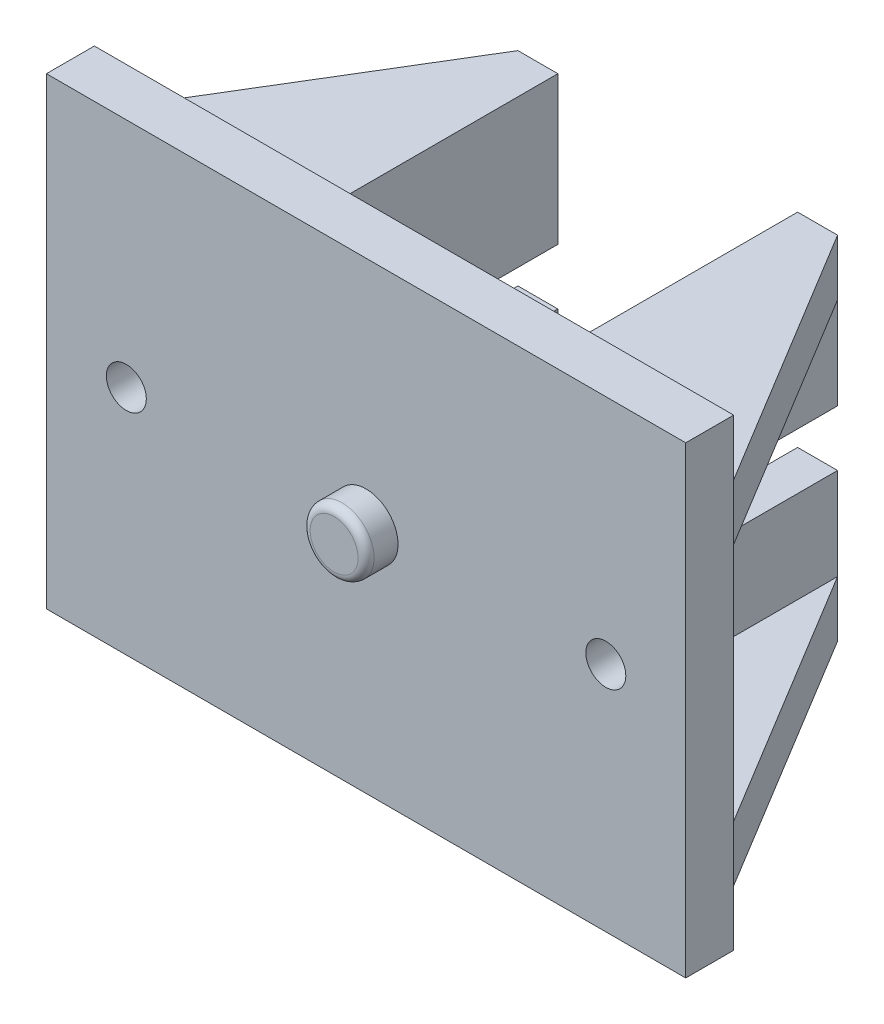
ISO-10303-21;
HEADER;
FILE_DESCRIPTION(('STEP AP214'),'2;1');
FILE_NAME('part.step','',(''),(''),'','','');
FILE_SCHEMA(('AUTOMOTIVE_DESIGN { 1 0 10303 214 1 1 1 1 }'));
ENDSEC;
DATA;
#1=APPLICATION_CONTEXT('core data for automotive mechanical design processes');
#2=APPLICATION_PROTOCOL_DEFINITION('international standard','automotive_design',2000,#1);
#3=PRODUCT_CONTEXT('',#1,'mechanical');
#4=PRODUCT('Part','Part','',(#3));
#5=PRODUCT_RELATED_PRODUCT_CATEGORY('part','',(#4));
#6=PRODUCT_DEFINITION_FORMATION('','',#4);
#7=PRODUCT_DEFINITION_CONTEXT('part definition',#1,'design');
#8=PRODUCT_DEFINITION('design','',#6,#7);
#9=PRODUCT_DEFINITION_SHAPE('','',#8);
#10=(LENGTH_UNIT() NAMED_UNIT(*) SI_UNIT(.MILLI.,.METRE.));
#11=(NAMED_UNIT(*) PLANE_ANGLE_UNIT() SI_UNIT($,.RADIAN.));
#12=(NAMED_UNIT(*) SI_UNIT($,.STERADIAN.) SOLID_ANGLE_UNIT());
#13=UNCERTAINTY_MEASURE_WITH_UNIT(LENGTH_MEASURE(1.E-05),#10,'distance_accuracy_value','');
#14=(GEOMETRIC_REPRESENTATION_CONTEXT(3) GLOBAL_UNCERTAINTY_ASSIGNED_CONTEXT((#13)) GLOBAL_UNIT_ASSIGNED_CONTEXT((#10,
#11,#12)) REPRESENTATION_CONTEXT('',''));
#15=CARTESIAN_POINT('',(0.,0.,0.));
#16=DIRECTION('',(0.,0.,1.));
#17=DIRECTION('',(1.,0.,0.));
#18=AXIS2_PLACEMENT_3D('',#15,#16,#17);
#19=CARTESIAN_POINT('',(0.,0.,0.));
#20=DIRECTION('',(0.,0.,-1.));
#21=DIRECTION('',(-1.,0.,0.));
#22=AXIS2_PLACEMENT_3D('',#19,#20,#21);
#23=PLANE('',#22);
#24=DIRECTION('',(1.,0.,0.));
#25=VECTOR('',#24,1.);
#26=CARTESIAN_POINT('',(20.,22.,0.));
#27=LINE('',#26,#25);
#28=CARTESIAN_POINT('',(15.,22.,0.));
#29=VERTEX_POINT('',#28);
#30=CARTESIAN_POINT('',(40.,22.,0.));
#31=VERTEX_POINT('',#30);
#32=EDGE_CURVE('E265',#29,#31,#27,.T.);
#33=ORIENTED_EDGE('',*,*,#32,.F.);
#34=DIRECTION('',(0.,1.,0.));
#35=VECTOR('',#34,1.);
#36=CARTESIAN_POINT('',(15.,22.,0.));
#37=LINE('',#36,#35);
#38=CARTESIAN_POINT('',(15.,-22.,0.));
#39=VERTEX_POINT('',#38);
#40=EDGE_CURVE('E268',#39,#29,#37,.T.);
#41=ORIENTED_EDGE('',*,*,#40,.F.);
#42=DIRECTION('',(-1.,0.,0.));
#43=VECTOR('',#42,1.);
#44=CARTESIAN_POINT('',(20.,-22.,0.));
#45=LINE('',#44,#43);
#46=CARTESIAN_POINT('',(40.,-22.,0.));
#47=VERTEX_POINT('',#46);
#48=EDGE_CURVE('E285',#47,#39,#45,.T.);
#49=ORIENTED_EDGE('',*,*,#48,.F.);
#50=DIRECTION('',(0.,1.,0.));
#51=VECTOR('',#50,1.);
#52=CARTESIAN_POINT('',(40.,-29.,0.));
#53=LINE('',#52,#51);
#54=CARTESIAN_POINT('',(40.,-29.,0.));
#55=VERTEX_POINT('',#54);
#56=EDGE_CURVE('E317',#55,#47,#53,.T.);
#57=ORIENTED_EDGE('',*,*,#56,.F.);
#58=DIRECTION('',(1.,0.,0.));
#59=VECTOR('',#58,1.);
#60=CARTESIAN_POINT('',(-40.,-29.,0.));
#61=LINE('',#60,#59);
#62=CARTESIAN_POINT('',(-40.,-29.,0.));
#63=VERTEX_POINT('',#62);
#64=EDGE_CURVE('E310',#63,#55,#61,.T.);
#65=ORIENTED_EDGE('',*,*,#64,.F.);
#66=DIRECTION('',(0.,-1.,0.));
#67=VECTOR('',#66,1.);
#68=CARTESIAN_POINT('',(-40.,-29.,0.));
#69=LINE('',#68,#67);
#70=CARTESIAN_POINT('',(-40.,-22.,0.));
#71=VERTEX_POINT('',#70);
#72=EDGE_CURVE('E324',#71,#63,#69,.T.);
#73=ORIENTED_EDGE('',*,*,#72,.F.);
#74=DIRECTION('',(-1.,0.,0.));
#75=VECTOR('',#74,1.);
#76=CARTESIAN_POINT('',(-15.,-22.,0.));
#77=LINE('',#76,#75);
#78=CARTESIAN_POINT('',(-15.,-22.,0.));
#79=VERTEX_POINT('',#78);
#80=EDGE_CURVE('E812',#79,#71,#77,.T.);
#81=ORIENTED_EDGE('',*,*,#80,.F.);
#82=DIRECTION('',(0.,-1.,0.));
#83=VECTOR('',#82,1.);
#84=CARTESIAN_POINT('',(-15.,22.,0.));
#85=LINE('',#84,#83);
#86=CARTESIAN_POINT('',(-15.,22.,0.));
#87=VERTEX_POINT('',#86);
#88=EDGE_CURVE('E798',#87,#79,#85,.T.);
#89=ORIENTED_EDGE('',*,*,#88,.F.);
#90=DIRECTION('',(1.,0.,0.));
#91=VECTOR('',#90,1.);
#92=CARTESIAN_POINT('',(-15.,22.,0.));
#93=LINE('',#92,#91);
#94=CARTESIAN_POINT('',(-40.,22.,0.));
#95=VERTEX_POINT('',#94);
#96=EDGE_CURVE('E816',#95,#87,#93,.T.);
#97=ORIENTED_EDGE('',*,*,#96,.F.);
#98=CARTESIAN_POINT('',(-40.,29.,0.));
#99=VERTEX_POINT('',#98);
#100=EDGE_CURVE('E325',#99,#95,#69,.T.);
#101=ORIENTED_EDGE('',*,*,#100,.F.);
#102=DIRECTION('',(-1.,0.,0.));
#103=VECTOR('',#102,1.);
#104=CARTESIAN_POINT('',(-40.,29.,0.));
#105=LINE('',#104,#103);
#106=CARTESIAN_POINT('',(40.,29.,0.));
#107=VERTEX_POINT('',#106);
#108=EDGE_CURVE('E320',#107,#99,#105,.T.);
#109=ORIENTED_EDGE('',*,*,#108,.F.);
#110=EDGE_CURVE('E304',#31,#107,#53,.T.);
#111=ORIENTED_EDGE('',*,*,#110,.F.);
#112=EDGE_LOOP('',(#33,#41,#49,#57,#65,#73,#81,#89,#97,#101,#109,#111));
#113=FACE_BOUND('',#112,.T.);
#114=ADVANCED_FACE('F33',(#113),#23,.T.);
#115=CARTESIAN_POINT('',(20.,22.,-33.));
#116=DIRECTION('',(-1.,0.,0.));
#117=DIRECTION('',(0.,0.,1.));
#118=AXIS2_PLACEMENT_3D('',#115,#116,#117);
#119=PLANE('',#118);
#120=DIRECTION('',(0.,-1.,0.));
#121=VECTOR('',#120,1.);
#122=CARTESIAN_POINT('',(20.,22.,0.));
#123=LINE('',#122,#121);
#124=CARTESIAN_POINT('',(20.,15.,0.));
#125=VERTEX_POINT('',#124);
#126=CARTESIAN_POINT('',(20.,-15.,0.));
#127=VERTEX_POINT('',#126);
#128=EDGE_CURVE('E258',#125,#127,#123,.T.);
#129=ORIENTED_EDGE('',*,*,#128,.T.);
#130=DIRECTION('',(0.,0.,-1.));
#131=VECTOR('',#130,1.);
#132=CARTESIAN_POINT('',(20.,-15.,-33.));
#133=LINE('',#132,#131);
#134=CARTESIAN_POINT('',(20.,-15.,-33.));
#135=VERTEX_POINT('',#134);
#136=EDGE_CURVE('E242',#127,#135,#133,.T.);
#137=ORIENTED_EDGE('',*,*,#136,.T.);
#138=DIRECTION('',(0.,-1.,0.));
#139=VECTOR('',#138,1.);
#140=CARTESIAN_POINT('',(20.,22.,-33.));
#141=LINE('',#140,#139);
#142=CARTESIAN_POINT('',(20.,-3.5,-33.));
#143=VERTEX_POINT('',#142);
#144=EDGE_CURVE('E255',#143,#135,#141,.T.);
#145=ORIENTED_EDGE('',*,*,#144,.F.);
#146=DIRECTION('',(0.,0.,1.));
#147=VECTOR('',#146,1.);
#148=CARTESIAN_POINT('',(20.,-3.5,-33.));
#149=LINE('',#148,#147);
#150=CARTESIAN_POINT('',(20.,-3.5,-11.));
#151=VERTEX_POINT('',#150);
#152=EDGE_CURVE('E774',#143,#151,#149,.T.);
#153=ORIENTED_EDGE('',*,*,#152,.T.);
#154=CARTESIAN_POINT('',(20.,-0.500000000000004,-11.));
#155=DIRECTION('',(-1.,0.,0.));
#156=DIRECTION('',(0.,0.,1.));
#157=AXIS2_PLACEMENT_3D('',#154,#155,#156);
#158=CIRCLE('',#157,3.);
#159=CARTESIAN_POINT('',(20.,-0.500000000000004,-8.));
#160=VERTEX_POINT('',#159);
#161=EDGE_CURVE('E795',#151,#160,#158,.T.);
#162=ORIENTED_EDGE('',*,*,#161,.T.);
#163=DIRECTION('',(0.,1.,0.));
#164=VECTOR('',#163,1.);
#165=CARTESIAN_POINT('',(20.,22.,-8.));
#166=LINE('',#165,#164);
#167=CARTESIAN_POINT('',(20.,0.500000000000004,-8.));
#168=VERTEX_POINT('',#167);
#169=EDGE_CURVE('E788',#160,#168,#166,.T.);
#170=ORIENTED_EDGE('',*,*,#169,.T.);
#171=CARTESIAN_POINT('',(20.,0.500000000000004,-11.));
#172=DIRECTION('',(-1.,0.,0.));
#173=DIRECTION('',(0.,0.,1.));
#174=AXIS2_PLACEMENT_3D('',#171,#172,#173);
#175=CIRCLE('',#174,3.);
#176=CARTESIAN_POINT('',(20.,3.5,-11.));
#177=VERTEX_POINT('',#176);
#178=EDGE_CURVE('E780',#168,#177,#175,.T.);
#179=ORIENTED_EDGE('',*,*,#178,.T.);
#180=DIRECTION('',(0.,0.,-1.));
#181=VECTOR('',#180,1.);
#182=CARTESIAN_POINT('',(20.,3.5,-33.));
#183=LINE('',#182,#181);
#184=CARTESIAN_POINT('',(20.,3.5,-33.));
#185=VERTEX_POINT('',#184);
#186=EDGE_CURVE('E765',#177,#185,#183,.T.);
#187=ORIENTED_EDGE('',*,*,#186,.T.);
#188=CARTESIAN_POINT('',(20.,15.,-33.));
#189=VERTEX_POINT('',#188);
#190=EDGE_CURVE('E264',#189,#185,#141,.T.);
#191=ORIENTED_EDGE('',*,*,#190,.F.);
#192=DIRECTION('',(0.,0.,-1.));
#193=VECTOR('',#192,1.);
#194=CARTESIAN_POINT('',(20.,15.,-33.));
#195=LINE('',#194,#193);
#196=EDGE_CURVE('E899',#125,#189,#195,.T.);
#197=ORIENTED_EDGE('',*,*,#196,.F.);
#198=EDGE_LOOP('',(#129,#137,#145,#153,#162,#170,#179,#187,#191,#197));
#199=FACE_BOUND('',#198,.T.);
#200=ADVANCED_FACE('F253',(#199),#119,.F.);
#201=DIRECTION('',(1.,0.,0.));
#202=VECTOR('',#201,1.);
#203=CARTESIAN_POINT('',(0.,-15.,0.));
#204=LINE('',#203,#202);
#205=CARTESIAN_POINT('',(-40.,-15.,0.));
#206=VERTEX_POINT('',#205);
#207=CARTESIAN_POINT('',(-20.,-15.,0.));
#208=VERTEX_POINT('',#207);
#209=EDGE_CURVE('E849',#206,#208,#204,.T.);
#210=ORIENTED_EDGE('',*,*,#209,.F.);
#211=CARTESIAN_POINT('',(-40.,15.,0.));
#212=VERTEX_POINT('',#211);
#213=EDGE_CURVE('E328',#212,#206,#69,.T.);
#214=ORIENTED_EDGE('',*,*,#213,.F.);
#215=DIRECTION('',(1.,0.,0.));
#216=VECTOR('',#215,1.);
#217=CARTESIAN_POINT('',(0.,15.,0.));
#218=LINE('',#217,#216);
#219=CARTESIAN_POINT('',(-20.,15.,0.));
#220=VERTEX_POINT('',#219);
#221=EDGE_CURVE('E862',#212,#220,#218,.T.);
#222=ORIENTED_EDGE('',*,*,#221,.T.);
#223=DIRECTION('',(0.,1.,0.));
#224=VECTOR('',#223,1.);
#225=CARTESIAN_POINT('',(-20.,22.,0.));
#226=LINE('',#225,#224);
#227=EDGE_CURVE('E814',#208,#220,#226,.T.);
#228=ORIENTED_EDGE('',*,*,#227,.F.);
#229=EDGE_LOOP('',(#210,#214,#222,#228));
#230=FACE_BOUND('',#229,.T.);
#231=CARTESIAN_POINT('',(-30.,0.,0.));
#232=DIRECTION('',(0.,0.,1.));
#233=DIRECTION('',(1.,0.,0.));
#234=AXIS2_PLACEMENT_3D('',#231,#232,#233);
#235=CIRCLE('',#234,2.5);
#236=CARTESIAN_POINT('',(-27.5,0.,0.));
#237=VERTEX_POINT('',#236);
#238=EDGE_CURVE('E298',#237,#237,#235,.T.);
#239=ORIENTED_EDGE('',*,*,#238,.T.);
#240=EDGE_LOOP('',(#239));
#241=FACE_BOUND('',#240,.T.);
#242=ADVANCED_FACE('F373',(#230,#241),#23,.T.);
#243=CARTESIAN_POINT('',(-20.,22.,-33.));
#244=DIRECTION('',(1.,0.,0.));
#245=DIRECTION('',(0.,1.,0.));
#246=AXIS2_PLACEMENT_3D('',#243,#244,#245);
#247=PLANE('',#246);
#248=DIRECTION('',(0.,1.,0.));
#249=VECTOR('',#248,1.);
#250=CARTESIAN_POINT('',(-20.,22.,-33.));
#251=LINE('',#250,#249);
#252=CARTESIAN_POINT('',(-20.,-15.,-33.));
#253=VERTEX_POINT('',#252);
#254=CARTESIAN_POINT('',(-20.,-3.49999999999999,-33.));
#255=VERTEX_POINT('',#254);
#256=EDGE_CURVE('E56',#253,#255,#251,.T.);
#257=ORIENTED_EDGE('',*,*,#256,.F.);
#258=DIRECTION('',(0.,0.,1.));
#259=VECTOR('',#258,1.);
#260=CARTESIAN_POINT('',(-20.,-15.,-33.));
#261=LINE('',#260,#259);
#262=EDGE_CURVE('E844',#253,#208,#261,.T.);
#263=ORIENTED_EDGE('',*,*,#262,.T.);
#264=ORIENTED_EDGE('',*,*,#227,.T.);
#265=DIRECTION('',(0.,0.,1.));
#266=VECTOR('',#265,1.);
#267=CARTESIAN_POINT('',(-20.,15.,-33.));
#268=LINE('',#267,#266);
#269=CARTESIAN_POINT('',(-20.,15.,-33.));
#270=VERTEX_POINT('',#269);
#271=EDGE_CURVE('E857',#270,#220,#268,.T.);
#272=ORIENTED_EDGE('',*,*,#271,.F.);
#273=CARTESIAN_POINT('',(-20.,3.5,-33.));
#274=VERTEX_POINT('',#273);
#275=EDGE_CURVE('E808',#274,#270,#251,.T.);
#276=ORIENTED_EDGE('',*,*,#275,.F.);
#277=DIRECTION('',(0.,0.,1.));
#278=VECTOR('',#277,1.);
#279=CARTESIAN_POINT('',(-20.,3.5,-33.));
#280=LINE('',#279,#278);
#281=CARTESIAN_POINT('',(-20.,3.50000000000001,-11.));
#282=VERTEX_POINT('',#281);
#283=EDGE_CURVE('E757',#274,#282,#280,.T.);
#284=ORIENTED_EDGE('',*,*,#283,.T.);
#285=CARTESIAN_POINT('',(-20.,0.500000000000009,-11.));
#286=DIRECTION('',(1.,0.,0.));
#287=DIRECTION('',(0.,1.,0.));
#288=AXIS2_PLACEMENT_3D('',#285,#286,#287);
#289=CIRCLE('',#288,3.);
#290=CARTESIAN_POINT('',(-20.,0.500000000000009,-8.));
#291=VERTEX_POINT('',#290);
#292=EDGE_CURVE('E347',#282,#291,#289,.T.);
#293=ORIENTED_EDGE('',*,*,#292,.T.);
#294=DIRECTION('',(0.,-1.,0.));
#295=VECTOR('',#294,1.);
#296=CARTESIAN_POINT('',(-20.,22.,-8.));
#297=LINE('',#296,#295);
#298=CARTESIAN_POINT('',(-20.,-0.499999999999999,-8.));
#299=VERTEX_POINT('',#298);
#300=EDGE_CURVE('E350',#291,#299,#297,.T.);
#301=ORIENTED_EDGE('',*,*,#300,.T.);
#302=CARTESIAN_POINT('',(-20.,-0.499999999999999,-11.));
#303=DIRECTION('',(1.,0.,0.));
#304=DIRECTION('',(0.,1.,0.));
#305=AXIS2_PLACEMENT_3D('',#302,#303,#304);
#306=CIRCLE('',#305,3.);
#307=CARTESIAN_POINT('',(-20.,-3.5,-11.));
#308=VERTEX_POINT('',#307);
#309=EDGE_CURVE('E353',#299,#308,#306,.T.);
#310=ORIENTED_EDGE('',*,*,#309,.T.);
#311=DIRECTION('',(0.,0.,-1.));
#312=VECTOR('',#311,1.);
#313=CARTESIAN_POINT('',(-20.,-3.5,-33.));
#314=LINE('',#313,#312);
#315=EDGE_CURVE('E731',#308,#255,#314,.T.);
#316=ORIENTED_EDGE('',*,*,#315,.T.);
#317=EDGE_LOOP('',(#257,#263,#264,#272,#276,#284,#293,#301,#310,#316));
#318=FACE_BOUND('',#317,.T.);
#319=ADVANCED_FACE('F383',(#318),#247,.F.);
#320=CARTESIAN_POINT('',(0.,0.,-33.));
#321=DIRECTION('',(0.,0.,-1.));
#322=DIRECTION('',(-1.,0.,0.));
#323=AXIS2_PLACEMENT_3D('',#320,#321,#322);
#324=PLANE('',#323);
#325=ORIENTED_EDGE('',*,*,#144,.T.);
#326=DIRECTION('',(0.,1.,0.));
#327=VECTOR('',#326,1.);
#328=CARTESIAN_POINT('',(20.,0.,-33.));
#329=LINE('',#328,#327);
#330=CARTESIAN_POINT('',(20.,-22.,-33.));
#331=VERTEX_POINT('',#330);
#332=EDGE_CURVE('E231',#135,#331,#329,.F.);
#333=ORIENTED_EDGE('',*,*,#332,.T.);
#334=DIRECTION('',(-1.,0.,0.));
#335=VECTOR('',#334,1.);
#336=CARTESIAN_POINT('',(20.,-22.,-33.));
#337=LINE('',#336,#335);
#338=CARTESIAN_POINT('',(15.,-22.,-33.));
#339=VERTEX_POINT('',#338);
#340=EDGE_CURVE('E273',#331,#339,#337,.T.);
#341=ORIENTED_EDGE('',*,*,#340,.T.);
#342=DIRECTION('',(0.,1.,0.));
#343=VECTOR('',#342,1.);
#344=CARTESIAN_POINT('',(15.,22.,-33.));
#345=LINE('',#344,#343);
#346=CARTESIAN_POINT('',(15.,-3.5,-33.));
#347=VERTEX_POINT('',#346);
#348=EDGE_CURVE('E278',#339,#347,#345,.T.);
#349=ORIENTED_EDGE('',*,*,#348,.T.);
#350=DIRECTION('',(1.,0.,0.));
#351=VECTOR('',#350,1.);
#352=CARTESIAN_POINT('',(-40.,-3.49999999999999,-33.));
#353=LINE('',#352,#351);
#354=EDGE_CURVE('E263',#347,#143,#353,.T.);
#355=ORIENTED_EDGE('',*,*,#354,.T.);
#356=EDGE_LOOP('',(#325,#333,#341,#349,#355));
#357=FACE_BOUND('',#356,.T.);
#358=ADVANCED_FACE('F261',(#357),#324,.T.);
#359=CARTESIAN_POINT('',(0.,0.,-33.));
#360=DIRECTION('',(0.,0.,-1.));
#361=DIRECTION('',(-1.,0.,0.));
#362=AXIS2_PLACEMENT_3D('',#359,#360,#361);
#363=PLANE('',#362);
#364=DIRECTION('',(0.,-1.,0.));
#365=VECTOR('',#364,1.);
#366=CARTESIAN_POINT('',(-15.,22.,-33.));
#367=LINE('',#366,#365);
#368=CARTESIAN_POINT('',(-15.,-3.5,-33.));
#369=VERTEX_POINT('',#368);
#370=CARTESIAN_POINT('',(-15.,-22.,-33.));
#371=VERTEX_POINT('',#370);
#372=EDGE_CURVE('E802',#369,#371,#367,.T.);
#373=ORIENTED_EDGE('',*,*,#372,.T.);
#374=DIRECTION('',(-1.,0.,0.));
#375=VECTOR('',#374,1.);
#376=CARTESIAN_POINT('',(-15.,-22.,-33.));
#377=LINE('',#376,#375);
#378=CARTESIAN_POINT('',(-20.,-22.,-33.));
#379=VERTEX_POINT('',#378);
#380=EDGE_CURVE('E801',#371,#379,#377,.T.);
#381=ORIENTED_EDGE('',*,*,#380,.T.);
#382=EDGE_CURVE('E805',#379,#253,#251,.T.);
#383=ORIENTED_EDGE('',*,*,#382,.T.);
#384=ORIENTED_EDGE('',*,*,#256,.T.);
#385=DIRECTION('',(-1.,0.,0.));
#386=VECTOR('',#385,1.);
#387=CARTESIAN_POINT('',(0.,-3.5,-33.));
#388=LINE('',#387,#386);
#389=EDGE_CURVE('E344',#369,#255,#388,.T.);
#390=ORIENTED_EDGE('',*,*,#389,.F.);
#391=EDGE_LOOP('',(#373,#381,#383,#384,#390));
#392=FACE_BOUND('',#391,.T.);
#393=ADVANCED_FACE('F387',(#392),#363,.T.);
#394=DIRECTION('',(1.,0.,0.));
#395=VECTOR('',#394,1.);
#396=CARTESIAN_POINT('',(0.,-15.,0.));
#397=LINE('',#396,#395);
#398=CARTESIAN_POINT('',(40.,-15.,0.));
#399=VERTEX_POINT('',#398);
#400=EDGE_CURVE('E248',#127,#399,#397,.T.);
#401=ORIENTED_EDGE('',*,*,#400,.F.);
#402=ORIENTED_EDGE('',*,*,#128,.F.);
#403=DIRECTION('',(1.,0.,0.));
#404=VECTOR('',#403,1.);
#405=CARTESIAN_POINT('',(0.,15.,0.));
#406=LINE('',#405,#404);
#407=CARTESIAN_POINT('',(40.,15.,0.));
#408=VERTEX_POINT('',#407);
#409=EDGE_CURVE('E846',#125,#408,#406,.T.);
#410=ORIENTED_EDGE('',*,*,#409,.T.);
#411=EDGE_CURVE('E322',#399,#408,#53,.T.);
#412=ORIENTED_EDGE('',*,*,#411,.F.);
#413=EDGE_LOOP('',(#401,#402,#410,#412));
#414=FACE_BOUND('',#413,.T.);
#415=CARTESIAN_POINT('',(30.,0.,0.));
#416=DIRECTION('',(0.,0.,1.));
#417=DIRECTION('',(1.,0.,0.));
#418=AXIS2_PLACEMENT_3D('',#415,#416,#417);
#419=CIRCLE('',#418,2.49999999999999);
#420=CARTESIAN_POINT('',(32.5,0.,0.));
#421=VERTEX_POINT('',#420);
#422=EDGE_CURVE('E294',#421,#421,#419,.T.);
#423=ORIENTED_EDGE('',*,*,#422,.T.);
#424=EDGE_LOOP('',(#423));
#425=FACE_BOUND('',#424,.T.);
#426=ADVANCED_FACE('F374',(#414,#425),#23,.T.);
#427=CARTESIAN_POINT('',(0.,0.,6.));
#428=DIRECTION('',(0.,0.,-1.));
#429=DIRECTION('',(-1.,0.,0.));
#430=AXIS2_PLACEMENT_3D('',#427,#428,#429);
#431=PLANE('',#430);
#432=DIRECTION('',(0.,-1.,0.));
#433=VECTOR('',#432,1.);
#434=CARTESIAN_POINT('',(-40.,-29.,6.));
#435=LINE('',#434,#433);
#436=CARTESIAN_POINT('',(-40.,29.,6.));
#437=VERTEX_POINT('',#436);
#438=CARTESIAN_POINT('',(-40.,-29.,6.));
#439=VERTEX_POINT('',#438);
#440=EDGE_CURVE('E312',#437,#439,#435,.T.);
#441=ORIENTED_EDGE('',*,*,#440,.T.);
#442=DIRECTION('',(1.,0.,0.));
#443=VECTOR('',#442,1.);
#444=CARTESIAN_POINT('',(-40.,-29.,6.));
#445=LINE('',#444,#443);
#446=CARTESIAN_POINT('',(40.,-29.,6.));
#447=VERTEX_POINT('',#446);
#448=EDGE_CURVE('E314',#439,#447,#445,.T.);
#449=ORIENTED_EDGE('',*,*,#448,.T.);
#450=DIRECTION('',(0.,1.,0.));
#451=VECTOR('',#450,1.);
#452=CARTESIAN_POINT('',(40.,-29.,6.));
#453=LINE('',#452,#451);
#454=CARTESIAN_POINT('',(40.,29.,6.));
#455=VERTEX_POINT('',#454);
#456=EDGE_CURVE('E307',#447,#455,#453,.T.);
#457=ORIENTED_EDGE('',*,*,#456,.T.);
#458=DIRECTION('',(-1.,0.,0.));
#459=VECTOR('',#458,1.);
#460=CARTESIAN_POINT('',(-40.,29.,6.));
#461=LINE('',#460,#459);
#462=EDGE_CURVE('E309',#455,#437,#461,.T.);
#463=ORIENTED_EDGE('',*,*,#462,.T.);
#464=EDGE_LOOP('',(#441,#449,#457,#463));
#465=FACE_BOUND('',#464,.T.);
#466=CARTESIAN_POINT('',(0.,0.,6.));
#467=DIRECTION('',(0.,0.,-1.));
#468=DIRECTION('',(-1.,0.,0.));
#469=AXIS2_PLACEMENT_3D('',#466,#467,#468);
#470=CIRCLE('',#469,4.);
#471=CARTESIAN_POINT('',(-4.,0.,6.));
#472=VERTEX_POINT('',#471);
#473=EDGE_CURVE('E356',#472,#472,#470,.F.);
#474=ORIENTED_EDGE('',*,*,#473,.F.);
#475=EDGE_LOOP('',(#474));
#476=FACE_BOUND('',#475,.T.);
#477=CARTESIAN_POINT('',(-30.,0.,6.));
#478=DIRECTION('',(0.,0.,1.));
#479=DIRECTION('',(1.,0.,0.));
#480=AXIS2_PLACEMENT_3D('',#477,#478,#479);
#481=CIRCLE('',#480,2.5);
#482=CARTESIAN_POINT('',(-27.5,0.,6.));
#483=VERTEX_POINT('',#482);
#484=EDGE_CURVE('E301',#483,#483,#481,.T.);
#485=ORIENTED_EDGE('',*,*,#484,.F.);
#486=EDGE_LOOP('',(#485));
#487=FACE_BOUND('',#486,.T.);
#488=CARTESIAN_POINT('',(30.,0.,6.));
#489=DIRECTION('',(0.,0.,1.));
#490=DIRECTION('',(1.,0.,0.));
#491=AXIS2_PLACEMENT_3D('',#488,#489,#490);
#492=CIRCLE('',#491,2.49999999999999);
#493=CARTESIAN_POINT('',(32.5,0.,6.));
#494=VERTEX_POINT('',#493);
#495=EDGE_CURVE('E295',#494,#494,#492,.T.);
#496=ORIENTED_EDGE('',*,*,#495,.F.);
#497=EDGE_LOOP('',(#496));
#498=FACE_BOUND('',#497,.T.);
#499=ADVANCED_FACE('F386',(#465,#476,#487,#498),#431,.F.);
#500=CARTESIAN_POINT('',(40.,-29.,6.));
#501=DIRECTION('',(-1.,0.,0.));
#502=DIRECTION('',(0.,0.,1.));
#503=AXIS2_PLACEMENT_3D('',#500,#501,#502);
#504=PLANE('',#503);
#505=DIRECTION('',(0.,0.,-1.));
#506=VECTOR('',#505,1.);
#507=CARTESIAN_POINT('',(40.,29.,6.));
#508=LINE('',#507,#506);
#509=EDGE_CURVE('E338',#455,#107,#508,.T.);
#510=ORIENTED_EDGE('',*,*,#509,.F.);
#511=ORIENTED_EDGE('',*,*,#456,.F.);
#512=DIRECTION('',(0.,0.,-1.));
#513=VECTOR('',#512,1.);
#514=CARTESIAN_POINT('',(40.,-29.,6.));
#515=LINE('',#514,#513);
#516=EDGE_CURVE('E316',#447,#55,#515,.T.);
#517=ORIENTED_EDGE('',*,*,#516,.T.);
#518=ORIENTED_EDGE('',*,*,#56,.T.);
#519=EDGE_CURVE('E321',#47,#399,#53,.T.);
#520=ORIENTED_EDGE('',*,*,#519,.T.);
#521=ORIENTED_EDGE('',*,*,#411,.T.);
#522=DIRECTION('',(0.,1.,0.));
#523=VECTOR('',#522,1.);
#524=CARTESIAN_POINT('',(40.,-29.,0.));
#525=LINE('',#524,#523);
#526=EDGE_CURVE('E842',#31,#408,#525,.F.);
#527=ORIENTED_EDGE('',*,*,#526,.F.);
#528=ORIENTED_EDGE('',*,*,#110,.T.);
#529=EDGE_LOOP('',(#510,#511,#517,#518,#520,#521,#527,#528));
#530=FACE_BOUND('',#529,.T.);
#531=ADVANCED_FACE('F393',(#530),#504,.F.);
#532=CARTESIAN_POINT('',(-40.,29.,6.));
#533=DIRECTION('',(0.,-1.,0.));
#534=DIRECTION('',(0.,0.,-1.));
#535=AXIS2_PLACEMENT_3D('',#532,#533,#534);
#536=PLANE('',#535);
#537=ORIENTED_EDGE('',*,*,#108,.T.);
#538=DIRECTION('',(0.,0.,-1.));
#539=VECTOR('',#538,1.);
#540=CARTESIAN_POINT('',(-40.,29.,6.));
#541=LINE('',#540,#539);
#542=EDGE_CURVE('E335',#437,#99,#541,.T.);
#543=ORIENTED_EDGE('',*,*,#542,.F.);
#544=ORIENTED_EDGE('',*,*,#462,.F.);
#545=ORIENTED_EDGE('',*,*,#509,.T.);
#546=EDGE_LOOP('',(#537,#543,#544,#545));
#547=FACE_BOUND('',#546,.T.);
#548=ADVANCED_FACE('F607',(#547),#536,.F.);
#549=CARTESIAN_POINT('',(-40.,-29.,6.));
#550=DIRECTION('',(1.,0.,0.));
#551=DIRECTION('',(0.,0.,-1.));
#552=AXIS2_PLACEMENT_3D('',#549,#550,#551);
#553=PLANE('',#552);
#554=ORIENTED_EDGE('',*,*,#213,.T.);
#555=EDGE_CURVE('E831',#206,#71,#69,.T.);
#556=ORIENTED_EDGE('',*,*,#555,.T.);
#557=ORIENTED_EDGE('',*,*,#72,.T.);
#558=DIRECTION('',(0.,0.,-1.));
#559=VECTOR('',#558,1.);
#560=CARTESIAN_POINT('',(-40.,-29.,6.));
#561=LINE('',#560,#559);
#562=EDGE_CURVE('E332',#439,#63,#561,.T.);
#563=ORIENTED_EDGE('',*,*,#562,.F.);
#564=ORIENTED_EDGE('',*,*,#440,.F.);
#565=ORIENTED_EDGE('',*,*,#542,.T.);
#566=ORIENTED_EDGE('',*,*,#100,.T.);
#567=DIRECTION('',(0.,1.,0.));
#568=VECTOR('',#567,1.);
#569=CARTESIAN_POINT('',(-40.,-29.,0.));
#570=LINE('',#569,#568);
#571=EDGE_CURVE('E756',#212,#95,#570,.T.);
#572=ORIENTED_EDGE('',*,*,#571,.F.);
#573=EDGE_LOOP('',(#554,#556,#557,#563,#564,#565,#566,#572));
#574=FACE_BOUND('',#573,.T.);
#575=ADVANCED_FACE('F614',(#574),#553,.F.);
#576=CARTESIAN_POINT('',(-40.,-29.,6.));
#577=DIRECTION('',(0.,1.,0.));
#578=DIRECTION('',(0.,0.,1.));
#579=AXIS2_PLACEMENT_3D('',#576,#577,#578);
#580=PLANE('',#579);
#581=ORIENTED_EDGE('',*,*,#64,.T.);
#582=ORIENTED_EDGE('',*,*,#516,.F.);
#583=ORIENTED_EDGE('',*,*,#448,.F.);
#584=ORIENTED_EDGE('',*,*,#562,.T.);
#585=EDGE_LOOP('',(#581,#582,#583,#584));
#586=FACE_BOUND('',#585,.T.);
#587=ADVANCED_FACE('F414',(#586),#580,.F.);
#588=CARTESIAN_POINT('',(-30.,0.,6.));
#589=DIRECTION('',(0.,0.,-1.));
#590=DIRECTION('',(-1.,0.,0.));
#591=AXIS2_PLACEMENT_3D('',#588,#589,#590);
#592=CYLINDRICAL_SURFACE('',#591,2.5);
#593=ORIENTED_EDGE('',*,*,#484,.T.);
#594=EDGE_LOOP('',(#593));
#595=FACE_BOUND('',#594,.T.);
#596=ORIENTED_EDGE('',*,*,#238,.F.);
#597=EDGE_LOOP('',(#596));
#598=FACE_BOUND('',#597,.T.);
#599=ADVANCED_FACE('F404',(#595,#598),#592,.F.);
#600=CARTESIAN_POINT('',(30.,0.,6.));
#601=DIRECTION('',(0.,0.,-1.));
#602=DIRECTION('',(-1.,0.,0.));
#603=AXIS2_PLACEMENT_3D('',#600,#601,#602);
#604=CYLINDRICAL_SURFACE('',#603,2.49999999999999);
#605=ORIENTED_EDGE('',*,*,#495,.T.);
#606=EDGE_LOOP('',(#605));
#607=FACE_BOUND('',#606,.T.);
#608=ORIENTED_EDGE('',*,*,#422,.F.);
#609=EDGE_LOOP('',(#608));
#610=FACE_BOUND('',#609,.T.);
#611=ADVANCED_FACE('F401',(#607,#610),#604,.F.);
#612=CARTESIAN_POINT('',(20.,-22.,-33.));
#613=DIRECTION('',(0.,1.,0.));
#614=DIRECTION('',(0.,0.,1.));
#615=AXIS2_PLACEMENT_3D('',#612,#613,#614);
#616=PLANE('',#615);
#617=ORIENTED_EDGE('',*,*,#48,.T.);
#618=DIRECTION('',(0.,0.,1.));
#619=VECTOR('',#618,1.);
#620=CARTESIAN_POINT('',(15.,-22.,-33.));
#621=LINE('',#620,#619);
#622=EDGE_CURVE('E291',#339,#39,#621,.T.);
#623=ORIENTED_EDGE('',*,*,#622,.F.);
#624=ORIENTED_EDGE('',*,*,#340,.F.);
#625=DIRECTION('',(0.518301716093344,0.,0.855197831554018));
#626=VECTOR('',#625,1.);
#627=CARTESIAN_POINT('',(20.,-22.,-33.));
#628=LINE('',#627,#626);
#629=EDGE_CURVE('E238',#331,#47,#628,.T.);
#630=ORIENTED_EDGE('',*,*,#629,.T.);
#631=EDGE_LOOP('',(#617,#623,#624,#630));
#632=FACE_BOUND('',#631,.T.);
#633=ADVANCED_FACE('F403',(#632),#616,.F.);
#634=CARTESIAN_POINT('',(15.,22.,-33.));
#635=DIRECTION('',(1.,0.,0.));
#636=DIRECTION('',(0.,0.,-1.));
#637=AXIS2_PLACEMENT_3D('',#634,#635,#636);
#638=PLANE('',#637);
#639=DIRECTION('',(0.,0.,-1.));
#640=VECTOR('',#639,1.);
#641=CARTESIAN_POINT('',(15.,-3.5,-33.));
#642=LINE('',#641,#640);
#643=CARTESIAN_POINT('',(15.,-3.5,-11.));
#644=VERTEX_POINT('',#643);
#645=EDGE_CURVE('E771',#644,#347,#642,.T.);
#646=ORIENTED_EDGE('',*,*,#645,.T.);
#647=ORIENTED_EDGE('',*,*,#348,.F.);
#648=ORIENTED_EDGE('',*,*,#622,.T.);
#649=ORIENTED_EDGE('',*,*,#40,.T.);
#650=DIRECTION('',(0.,0.,1.));
#651=VECTOR('',#650,1.);
#652=CARTESIAN_POINT('',(15.,22.,-33.));
#653=LINE('',#652,#651);
#654=CARTESIAN_POINT('',(15.,22.,-33.));
#655=VERTEX_POINT('',#654);
#656=EDGE_CURVE('E283',#655,#29,#653,.T.);
#657=ORIENTED_EDGE('',*,*,#656,.F.);
#658=CARTESIAN_POINT('',(15.,3.5,-33.));
#659=VERTEX_POINT('',#658);
#660=EDGE_CURVE('E276',#659,#655,#345,.T.);
#661=ORIENTED_EDGE('',*,*,#660,.F.);
#662=DIRECTION('',(0.,0.,1.));
#663=VECTOR('',#662,1.);
#664=CARTESIAN_POINT('',(15.,3.5,-33.));
#665=LINE('',#664,#663);
#666=CARTESIAN_POINT('',(15.,3.5,-11.));
#667=VERTEX_POINT('',#666);
#668=EDGE_CURVE('E762',#659,#667,#665,.T.);
#669=ORIENTED_EDGE('',*,*,#668,.T.);
#670=CARTESIAN_POINT('',(15.,0.500000000000004,-11.));
#671=DIRECTION('',(1.,0.,0.));
#672=DIRECTION('',(0.,0.,-1.));
#673=AXIS2_PLACEMENT_3D('',#670,#671,#672);
#674=CIRCLE('',#673,3.);
#675=CARTESIAN_POINT('',(15.,0.500000000000004,-8.));
#676=VERTEX_POINT('',#675);
#677=EDGE_CURVE('E777',#667,#676,#674,.T.);
#678=ORIENTED_EDGE('',*,*,#677,.T.);
#679=DIRECTION('',(0.,-1.,0.));
#680=VECTOR('',#679,1.);
#681=CARTESIAN_POINT('',(15.,22.,-8.));
#682=LINE('',#681,#680);
#683=CARTESIAN_POINT('',(15.,-0.500000000000004,-8.));
#684=VERTEX_POINT('',#683);
#685=EDGE_CURVE('E785',#676,#684,#682,.T.);
#686=ORIENTED_EDGE('',*,*,#685,.T.);
#687=CARTESIAN_POINT('',(15.,-0.500000000000003,-11.));
#688=DIRECTION('',(1.,0.,0.));
#689=DIRECTION('',(0.,0.,-1.));
#690=AXIS2_PLACEMENT_3D('',#687,#688,#689);
#691=CIRCLE('',#690,3.);
#692=EDGE_CURVE('E792',#684,#644,#691,.T.);
#693=ORIENTED_EDGE('',*,*,#692,.T.);
#694=EDGE_LOOP('',(#646,#647,#648,#649,#657,#661,#669,#678,#686,#693));
#695=FACE_BOUND('',#694,.T.);
#696=ADVANCED_FACE('F411',(#695),#638,.F.);
#697=CARTESIAN_POINT('',(20.,22.,-33.));
#698=DIRECTION('',(0.,-1.,0.));
#699=DIRECTION('',(0.,0.,-1.));
#700=AXIS2_PLACEMENT_3D('',#697,#698,#699);
#701=PLANE('',#700);
#702=ORIENTED_EDGE('',*,*,#32,.T.);
#703=DIRECTION('',(0.518301716093344,0.,0.855197831554018));
#704=VECTOR('',#703,1.);
#705=CARTESIAN_POINT('',(20.,22.,-33.));
#706=LINE('',#705,#704);
#707=CARTESIAN_POINT('',(20.,22.,-33.));
#708=VERTEX_POINT('',#707);
#709=EDGE_CURVE('E896',#708,#31,#706,.T.);
#710=ORIENTED_EDGE('',*,*,#709,.F.);
#711=DIRECTION('',(1.,0.,0.));
#712=VECTOR('',#711,1.);
#713=CARTESIAN_POINT('',(20.,22.,-33.));
#714=LINE('',#713,#712);
#715=EDGE_CURVE('E281',#655,#708,#714,.T.);
#716=ORIENTED_EDGE('',*,*,#715,.F.);
#717=ORIENTED_EDGE('',*,*,#656,.T.);
#718=EDGE_LOOP('',(#702,#710,#716,#717));
#719=FACE_BOUND('',#718,.T.);
#720=ADVANCED_FACE('F420',(#719),#701,.F.);
#721=EDGE_CURVE('E267',#708,#189,#141,.T.);
#722=ORIENTED_EDGE('',*,*,#721,.T.);
#723=ORIENTED_EDGE('',*,*,#190,.T.);
#724=DIRECTION('',(1.,0.,0.));
#725=VECTOR('',#724,1.);
#726=CARTESIAN_POINT('',(-40.,3.50000000000001,-33.));
#727=LINE('',#726,#725);
#728=EDGE_CURVE('E753',#659,#185,#727,.T.);
#729=ORIENTED_EDGE('',*,*,#728,.F.);
#730=ORIENTED_EDGE('',*,*,#660,.T.);
#731=ORIENTED_EDGE('',*,*,#715,.T.);
#732=EDGE_LOOP('',(#722,#723,#729,#730,#731));
#733=FACE_BOUND('',#732,.T.);
#734=ADVANCED_FACE('F424',(#733),#324,.T.);
#735=CARTESIAN_POINT('',(-15.,22.,-33.));
#736=DIRECTION('',(-1.,0.,0.));
#737=DIRECTION('',(0.,0.,1.));
#738=AXIS2_PLACEMENT_3D('',#735,#736,#737);
#739=PLANE('',#738);
#740=ORIENTED_EDGE('',*,*,#88,.T.);
#741=DIRECTION('',(0.,0.,1.));
#742=VECTOR('',#741,1.);
#743=CARTESIAN_POINT('',(-15.,-22.,-33.));
#744=LINE('',#743,#742);
#745=EDGE_CURVE('E286',#371,#79,#744,.T.);
#746=ORIENTED_EDGE('',*,*,#745,.F.);
#747=ORIENTED_EDGE('',*,*,#372,.F.);
#748=DIRECTION('',(0.,0.,1.));
#749=VECTOR('',#748,1.);
#750=CARTESIAN_POINT('',(-15.,-3.5,-33.));
#751=LINE('',#750,#749);
#752=CARTESIAN_POINT('',(-15.,-3.5,-11.));
#753=VERTEX_POINT('',#752);
#754=EDGE_CURVE('E769',#369,#753,#751,.T.);
#755=ORIENTED_EDGE('',*,*,#754,.T.);
#756=CARTESIAN_POINT('',(-15.,-0.5,-11.));
#757=DIRECTION('',(-1.,0.,0.));
#758=DIRECTION('',(0.,0.,1.));
#759=AXIS2_PLACEMENT_3D('',#756,#757,#758);
#760=CIRCLE('',#759,3.);
#761=CARTESIAN_POINT('',(-15.,-0.5,-8.));
#762=VERTEX_POINT('',#761);
#763=EDGE_CURVE('E727',#753,#762,#760,.T.);
#764=ORIENTED_EDGE('',*,*,#763,.T.);
#765=DIRECTION('',(0.,1.,0.));
#766=VECTOR('',#765,1.);
#767=CARTESIAN_POINT('',(-15.,22.,-8.));
#768=LINE('',#767,#766);
#769=CARTESIAN_POINT('',(-15.,0.500000000000008,-8.));
#770=VERTEX_POINT('',#769);
#771=EDGE_CURVE('E783',#762,#770,#768,.T.);
#772=ORIENTED_EDGE('',*,*,#771,.T.);
#773=CARTESIAN_POINT('',(-15.,0.500000000000008,-11.));
#774=DIRECTION('',(-1.,0.,0.));
#775=DIRECTION('',(0.,0.,1.));
#776=AXIS2_PLACEMENT_3D('',#773,#774,#775);
#777=CIRCLE('',#776,3.);
#778=CARTESIAN_POINT('',(-15.,3.50000000000001,-11.));
#779=VERTEX_POINT('',#778);
#780=EDGE_CURVE('E741',#770,#779,#777,.T.);
#781=ORIENTED_EDGE('',*,*,#780,.T.);
#782=DIRECTION('',(0.,0.,-1.));
#783=VECTOR('',#782,1.);
#784=CARTESIAN_POINT('',(-15.,3.5,-33.));
#785=LINE('',#784,#783);
#786=CARTESIAN_POINT('',(-15.,3.5,-33.));
#787=VERTEX_POINT('',#786);
#788=EDGE_CURVE('E759',#779,#787,#785,.T.);
#789=ORIENTED_EDGE('',*,*,#788,.T.);
#790=CARTESIAN_POINT('',(-15.,22.,-33.));
#791=VERTEX_POINT('',#790);
#792=EDGE_CURVE('E799',#791,#787,#367,.T.);
#793=ORIENTED_EDGE('',*,*,#792,.F.);
#794=DIRECTION('',(0.,0.,1.));
#795=VECTOR('',#794,1.);
#796=CARTESIAN_POINT('',(-15.,22.,-33.));
#797=LINE('',#796,#795);
#798=EDGE_CURVE('E810',#791,#87,#797,.T.);
#799=ORIENTED_EDGE('',*,*,#798,.T.);
#800=EDGE_LOOP('',(#740,#746,#747,#755,#764,#772,#781,#789,#793,#799));
#801=FACE_BOUND('',#800,.T.);
#802=ADVANCED_FACE('F428',(#801),#739,.F.);
#803=CARTESIAN_POINT('',(-15.,-22.,-33.));
#804=DIRECTION('',(0.,1.,0.));
#805=DIRECTION('',(0.,0.,1.));
#806=AXIS2_PLACEMENT_3D('',#803,#804,#805);
#807=PLANE('',#806);
#808=ORIENTED_EDGE('',*,*,#80,.T.);
#809=DIRECTION('',(-0.518301716093344,0.,0.855197831554018));
#810=VECTOR('',#809,1.);
#811=CARTESIAN_POINT('',(-20.,-22.,-33.));
#812=LINE('',#811,#810);
#813=EDGE_CURVE('E840',#379,#71,#812,.T.);
#814=ORIENTED_EDGE('',*,*,#813,.F.);
#815=ORIENTED_EDGE('',*,*,#380,.F.);
#816=ORIENTED_EDGE('',*,*,#745,.T.);
#817=EDGE_LOOP('',(#808,#814,#815,#816));
#818=FACE_BOUND('',#817,.T.);
#819=ADVANCED_FACE('F431',(#818),#807,.F.);
#820=CARTESIAN_POINT('',(-15.,22.,-33.));
#821=DIRECTION('',(0.,-1.,0.));
#822=DIRECTION('',(0.,0.,-1.));
#823=AXIS2_PLACEMENT_3D('',#820,#821,#822);
#824=PLANE('',#823);
#825=ORIENTED_EDGE('',*,*,#96,.T.);
#826=ORIENTED_EDGE('',*,*,#798,.F.);
#827=DIRECTION('',(1.,0.,0.));
#828=VECTOR('',#827,1.);
#829=CARTESIAN_POINT('',(-15.,22.,-33.));
#830=LINE('',#829,#828);
#831=CARTESIAN_POINT('',(-20.,22.,-33.));
#832=VERTEX_POINT('',#831);
#833=EDGE_CURVE('E807',#832,#791,#830,.T.);
#834=ORIENTED_EDGE('',*,*,#833,.F.);
#835=DIRECTION('',(-0.518301716093344,0.,0.855197831554018));
#836=VECTOR('',#835,1.);
#837=CARTESIAN_POINT('',(-20.,22.,-33.));
#838=LINE('',#837,#836);
#839=EDGE_CURVE('E854',#832,#95,#838,.T.);
#840=ORIENTED_EDGE('',*,*,#839,.T.);
#841=EDGE_LOOP('',(#825,#826,#834,#840));
#842=FACE_BOUND('',#841,.T.);
#843=ADVANCED_FACE('F435',(#842),#824,.F.);
#844=ORIENTED_EDGE('',*,*,#792,.T.);
#845=DIRECTION('',(1.,0.,0.));
#846=VECTOR('',#845,1.);
#847=CARTESIAN_POINT('',(0.,3.5,-33.));
#848=LINE('',#847,#846);
#849=EDGE_CURVE('E341',#274,#787,#848,.T.);
#850=ORIENTED_EDGE('',*,*,#849,.F.);
#851=ORIENTED_EDGE('',*,*,#275,.T.);
#852=EDGE_CURVE('E804',#270,#832,#251,.T.);
#853=ORIENTED_EDGE('',*,*,#852,.T.);
#854=ORIENTED_EDGE('',*,*,#833,.T.);
#855=EDGE_LOOP('',(#844,#850,#851,#853,#854));
#856=FACE_BOUND('',#855,.T.);
#857=ADVANCED_FACE('F397',(#856),#363,.T.);
#858=CARTESIAN_POINT('',(-40.,3.50000000000001,-33.));
#859=DIRECTION('',(0.,1.,0.));
#860=DIRECTION('',(0.,0.,1.));
#861=AXIS2_PLACEMENT_3D('',#858,#859,#860);
#862=PLANE('',#861);
#863=DIRECTION('',(1.,0.,0.));
#864=VECTOR('',#863,1.);
#865=CARTESIAN_POINT('',(-40.,3.50000000000001,-11.));
#866=LINE('',#865,#864);
#867=EDGE_CURVE('E748',#282,#779,#866,.T.);
#868=ORIENTED_EDGE('',*,*,#867,.F.);
#869=ORIENTED_EDGE('',*,*,#283,.F.);
#870=ORIENTED_EDGE('',*,*,#849,.T.);
#871=ORIENTED_EDGE('',*,*,#788,.F.);
#872=EDGE_LOOP('',(#868,#869,#870,#871));
#873=FACE_BOUND('',#872,.T.);
#874=ADVANCED_FACE('F443',(#873),#862,.F.);
#875=CARTESIAN_POINT('',(-40.,0.500000000000011,-11.));
#876=DIRECTION('',(1.,0.,0.));
#877=DIRECTION('',(0.,1.,0.));
#878=AXIS2_PLACEMENT_3D('',#875,#876,#877);
#879=CYLINDRICAL_SURFACE('',#878,3.);
#880=DIRECTION('',(1.,0.,0.));
#881=VECTOR('',#880,1.);
#882=CARTESIAN_POINT('',(-40.,0.500000000000011,-8.));
#883=LINE('',#882,#881);
#884=EDGE_CURVE('E735',#291,#770,#883,.T.);
#885=ORIENTED_EDGE('',*,*,#884,.F.);
#886=ORIENTED_EDGE('',*,*,#292,.F.);
#887=ORIENTED_EDGE('',*,*,#867,.T.);
#888=ORIENTED_EDGE('',*,*,#780,.F.);
#889=EDGE_LOOP('',(#885,#886,#887,#888));
#890=FACE_BOUND('',#889,.T.);
#891=ADVANCED_FACE('F456',(#890),#879,.F.);
#892=CARTESIAN_POINT('',(-40.,-0.499999999999997,-8.));
#893=DIRECTION('',(0.,0.,1.));
#894=DIRECTION('',(1.,0.,0.));
#895=AXIS2_PLACEMENT_3D('',#892,#893,#894);
#896=PLANE('',#895);
#897=DIRECTION('',(1.,0.,0.));
#898=VECTOR('',#897,1.);
#899=CARTESIAN_POINT('',(-40.,-0.499999999999997,-8.));
#900=LINE('',#899,#898);
#901=EDGE_CURVE('E737',#299,#762,#900,.T.);
#902=ORIENTED_EDGE('',*,*,#901,.F.);
#903=ORIENTED_EDGE('',*,*,#300,.F.);
#904=ORIENTED_EDGE('',*,*,#884,.T.);
#905=ORIENTED_EDGE('',*,*,#771,.F.);
#906=EDGE_LOOP('',(#902,#903,#904,#905));
#907=FACE_BOUND('',#906,.T.);
#908=ADVANCED_FACE('F461',(#907),#896,.F.);
#909=CARTESIAN_POINT('',(-40.,-3.49999999999999,-33.));
#910=DIRECTION('',(0.,-1.,0.));
#911=DIRECTION('',(0.,0.,-1.));
#912=AXIS2_PLACEMENT_3D('',#909,#910,#911);
#913=PLANE('',#912);
#914=ORIENTED_EDGE('',*,*,#389,.T.);
#915=ORIENTED_EDGE('',*,*,#315,.F.);
#916=DIRECTION('',(1.,0.,0.));
#917=VECTOR('',#916,1.);
#918=CARTESIAN_POINT('',(-40.,-3.5,-11.));
#919=LINE('',#918,#917);
#920=EDGE_CURVE('E723',#308,#753,#919,.T.);
#921=ORIENTED_EDGE('',*,*,#920,.T.);
#922=ORIENTED_EDGE('',*,*,#754,.F.);
#923=EDGE_LOOP('',(#914,#915,#921,#922));
#924=FACE_BOUND('',#923,.T.);
#925=ADVANCED_FACE('F469',(#924),#913,.F.);
#926=CARTESIAN_POINT('',(-40.,-0.499999999999997,-11.));
#927=DIRECTION('',(1.,0.,0.));
#928=DIRECTION('',(0.,1.,0.));
#929=AXIS2_PLACEMENT_3D('',#926,#927,#928);
#930=CYLINDRICAL_SURFACE('',#929,3.);
#931=ORIENTED_EDGE('',*,*,#920,.F.);
#932=ORIENTED_EDGE('',*,*,#309,.F.);
#933=ORIENTED_EDGE('',*,*,#901,.T.);
#934=ORIENTED_EDGE('',*,*,#763,.F.);
#935=EDGE_LOOP('',(#931,#932,#933,#934));
#936=FACE_BOUND('',#935,.T.);
#937=ADVANCED_FACE('F464',(#936),#930,.F.);
#938=EDGE_CURVE('E729',#644,#151,#919,.T.);
#939=ORIENTED_EDGE('',*,*,#938,.F.);
#940=ORIENTED_EDGE('',*,*,#692,.F.);
#941=EDGE_CURVE('E742',#684,#160,#900,.T.);
#942=ORIENTED_EDGE('',*,*,#941,.T.);
#943=ORIENTED_EDGE('',*,*,#161,.F.);
#944=EDGE_LOOP('',(#939,#940,#942,#943));
#945=FACE_BOUND('',#944,.T.);
#946=ADVANCED_FACE('F459',(#945),#930,.F.);
#947=ORIENTED_EDGE('',*,*,#941,.F.);
#948=ORIENTED_EDGE('',*,*,#685,.F.);
#949=EDGE_CURVE('E743',#676,#168,#883,.T.);
#950=ORIENTED_EDGE('',*,*,#949,.T.);
#951=ORIENTED_EDGE('',*,*,#169,.F.);
#952=EDGE_LOOP('',(#947,#948,#950,#951));
#953=FACE_BOUND('',#952,.T.);
#954=ADVANCED_FACE('F454',(#953),#896,.F.);
#955=ORIENTED_EDGE('',*,*,#949,.F.);
#956=ORIENTED_EDGE('',*,*,#677,.F.);
#957=EDGE_CURVE('E750',#667,#177,#866,.T.);
#958=ORIENTED_EDGE('',*,*,#957,.T.);
#959=ORIENTED_EDGE('',*,*,#178,.F.);
#960=EDGE_LOOP('',(#955,#956,#958,#959));
#961=FACE_BOUND('',#960,.T.);
#962=ADVANCED_FACE('F451',(#961),#879,.F.);
#963=ORIENTED_EDGE('',*,*,#354,.F.);
#964=ORIENTED_EDGE('',*,*,#645,.F.);
#965=ORIENTED_EDGE('',*,*,#938,.T.);
#966=ORIENTED_EDGE('',*,*,#152,.F.);
#967=EDGE_LOOP('',(#963,#964,#965,#966));
#968=FACE_BOUND('',#967,.T.);
#969=ADVANCED_FACE('F449',(#968),#913,.F.);
#970=ORIENTED_EDGE('',*,*,#957,.F.);
#971=ORIENTED_EDGE('',*,*,#668,.F.);
#972=ORIENTED_EDGE('',*,*,#728,.T.);
#973=ORIENTED_EDGE('',*,*,#186,.F.);
#974=EDGE_LOOP('',(#970,#971,#972,#973));
#975=FACE_BOUND('',#974,.T.);
#976=ADVANCED_FACE('F445',(#975),#862,.F.);
#977=CARTESIAN_POINT('',(0.,0.,10.));
#978=DIRECTION('',(0.,0.,-1.));
#979=DIRECTION('',(-1.,0.,0.));
#980=AXIS2_PLACEMENT_3D('',#977,#978,#979);
#981=CYLINDRICAL_SURFACE('',#980,4.);
#982=CARTESIAN_POINT('',(0.,0.,9.));
#983=DIRECTION('',(0.,0.,1.));
#984=DIRECTION('',(1.,0.,0.));
#985=AXIS2_PLACEMENT_3D('',#982,#983,#984);
#986=CIRCLE('',#985,4.);
#987=CARTESIAN_POINT('',(4.,0.,9.));
#988=VERTEX_POINT('',#987);
#989=EDGE_CURVE('E11',#988,#988,#986,.F.);
#990=ORIENTED_EDGE('',*,*,#989,.T.);
#991=EDGE_LOOP('',(#990));
#992=FACE_BOUND('',#991,.T.);
#993=ORIENTED_EDGE('',*,*,#473,.T.);
#994=EDGE_LOOP('',(#993));
#995=FACE_BOUND('',#994,.T.);
#996=ADVANCED_FACE('F448',(#992,#995),#981,.T.);
#997=CARTESIAN_POINT('',(0.,0.,10.));
#998=DIRECTION('',(0.,0.,1.));
#999=DIRECTION('',(1.,0.,0.));
#1000=AXIS2_PLACEMENT_3D('',#997,#998,#999);
#1001=PLANE('',#1000);
#1002=CARTESIAN_POINT('',(0.,0.,10.));
#1003=DIRECTION('',(0.,0.,1.));
#1004=DIRECTION('',(1.,0.,0.));
#1005=AXIS2_PLACEMENT_3D('',#1002,#1003,#1004);
#1006=CIRCLE('',#1005,3.);
#1007=CARTESIAN_POINT('',(3.,0.,10.));
#1008=VERTEX_POINT('',#1007);
#1009=EDGE_CURVE('E41',#1008,#1008,#1006,.T.);
#1010=ORIENTED_EDGE('',*,*,#1009,.T.);
#1011=EDGE_LOOP('',(#1010));
#1012=FACE_BOUND('',#1011,.T.);
#1013=ADVANCED_FACE('F361',(#1012),#1001,.T.);
#1014=CARTESIAN_POINT('',(-20.,15.,-33.));
#1015=DIRECTION('',(-0.855197831554018,0.,-0.518301716093344));
#1016=DIRECTION('',(-0.518301716093344,0.,0.855197831554018));
#1017=AXIS2_PLACEMENT_3D('',#1014,#1015,#1016);
#1018=PLANE('',#1017);
#1019=DIRECTION('',(-0.518301716093344,0.,0.855197831554018));
#1020=VECTOR('',#1019,1.);
#1021=CARTESIAN_POINT('',(-20.,15.,-33.));
#1022=LINE('',#1021,#1020);
#1023=EDGE_CURVE('E852',#270,#212,#1022,.T.);
#1024=ORIENTED_EDGE('',*,*,#1023,.T.);
#1025=ORIENTED_EDGE('',*,*,#571,.T.);
#1026=ORIENTED_EDGE('',*,*,#839,.F.);
#1027=ORIENTED_EDGE('',*,*,#852,.F.);
#1028=EDGE_LOOP('',(#1024,#1025,#1026,#1027));
#1029=FACE_BOUND('',#1028,.T.);
#1030=ADVANCED_FACE('F475',(#1029),#1018,.T.);
#1031=CARTESIAN_POINT('',(0.,15.,-11.5));
#1032=DIRECTION('',(0.,1.,0.));
#1033=DIRECTION('',(0.,0.,1.));
#1034=AXIS2_PLACEMENT_3D('',#1031,#1032,#1033);
#1035=PLANE('',#1034);
#1036=ORIENTED_EDGE('',*,*,#221,.F.);
#1037=ORIENTED_EDGE('',*,*,#1023,.F.);
#1038=ORIENTED_EDGE('',*,*,#271,.T.);
#1039=EDGE_LOOP('',(#1036,#1037,#1038));
#1040=FACE_BOUND('',#1039,.T.);
#1041=ADVANCED_FACE('F478',(#1040),#1035,.F.);
#1042=CARTESIAN_POINT('',(-20.,-15.,-33.));
#1043=DIRECTION('',(-0.855197831554018,0.,-0.518301716093344));
#1044=DIRECTION('',(-0.518301716093344,0.,0.855197831554018));
#1045=AXIS2_PLACEMENT_3D('',#1042,#1043,#1044);
#1046=PLANE('',#1045);
#1047=ORIENTED_EDGE('',*,*,#382,.F.);
#1048=ORIENTED_EDGE('',*,*,#813,.T.);
#1049=ORIENTED_EDGE('',*,*,#555,.F.);
#1050=DIRECTION('',(-0.518301716093344,0.,0.855197831554018));
#1051=VECTOR('',#1050,1.);
#1052=CARTESIAN_POINT('',(-20.,-15.,-33.));
#1053=LINE('',#1052,#1051);
#1054=EDGE_CURVE('E841',#253,#206,#1053,.T.);
#1055=ORIENTED_EDGE('',*,*,#1054,.F.);
#1056=EDGE_LOOP('',(#1047,#1048,#1049,#1055));
#1057=FACE_BOUND('',#1056,.T.);
#1058=ADVANCED_FACE('F482',(#1057),#1046,.T.);
#1059=CARTESIAN_POINT('',(0.,-15.,-11.5));
#1060=DIRECTION('',(0.,1.,0.));
#1061=DIRECTION('',(0.,0.,1.));
#1062=AXIS2_PLACEMENT_3D('',#1059,#1060,#1061);
#1063=PLANE('',#1062);
#1064=ORIENTED_EDGE('',*,*,#1054,.T.);
#1065=ORIENTED_EDGE('',*,*,#209,.T.);
#1066=ORIENTED_EDGE('',*,*,#262,.F.);
#1067=EDGE_LOOP('',(#1064,#1065,#1066));
#1068=FACE_BOUND('',#1067,.T.);
#1069=ADVANCED_FACE('F486',(#1068),#1063,.T.);
#1070=CARTESIAN_POINT('',(20.,15.,-33.));
#1071=DIRECTION('',(-0.855197831554018,0.,0.518301716093344));
#1072=DIRECTION('',(0.518301716093344,0.,0.855197831554018));
#1073=AXIS2_PLACEMENT_3D('',#1070,#1071,#1072);
#1074=PLANE('',#1073);
#1075=ORIENTED_EDGE('',*,*,#709,.T.);
#1076=ORIENTED_EDGE('',*,*,#526,.T.);
#1077=DIRECTION('',(0.518301716093344,0.,0.855197831554018));
#1078=VECTOR('',#1077,1.);
#1079=CARTESIAN_POINT('',(20.,15.,-33.));
#1080=LINE('',#1079,#1078);
#1081=EDGE_CURVE('E48',#189,#408,#1080,.T.);
#1082=ORIENTED_EDGE('',*,*,#1081,.F.);
#1083=ORIENTED_EDGE('',*,*,#721,.F.);
#1084=EDGE_LOOP('',(#1075,#1076,#1082,#1083));
#1085=FACE_BOUND('',#1084,.T.);
#1086=ADVANCED_FACE('F490',(#1085),#1074,.F.);
#1087=CARTESIAN_POINT('',(0.,15.,-11.5));
#1088=DIRECTION('',(0.,1.,0.));
#1089=DIRECTION('',(0.,0.,1.));
#1090=AXIS2_PLACEMENT_3D('',#1087,#1088,#1089);
#1091=PLANE('',#1090);
#1092=ORIENTED_EDGE('',*,*,#409,.F.);
#1093=ORIENTED_EDGE('',*,*,#196,.T.);
#1094=ORIENTED_EDGE('',*,*,#1081,.T.);
#1095=EDGE_LOOP('',(#1092,#1093,#1094));
#1096=FACE_BOUND('',#1095,.T.);
#1097=ADVANCED_FACE('F494',(#1096),#1091,.F.);
#1098=CARTESIAN_POINT('',(20.,-15.,-33.));
#1099=DIRECTION('',(-0.855197831554018,0.,0.518301716093344));
#1100=DIRECTION('',(0.518301716093344,0.,0.855197831554018));
#1101=AXIS2_PLACEMENT_3D('',#1098,#1099,#1100);
#1102=PLANE('',#1101);
#1103=ORIENTED_EDGE('',*,*,#332,.F.);
#1104=DIRECTION('',(0.518301716093344,0.,0.855197831554018));
#1105=VECTOR('',#1104,1.);
#1106=CARTESIAN_POINT('',(20.,-15.,-33.));
#1107=LINE('',#1106,#1105);
#1108=EDGE_CURVE('E235',#135,#399,#1107,.T.);
#1109=ORIENTED_EDGE('',*,*,#1108,.T.);
#1110=ORIENTED_EDGE('',*,*,#519,.F.);
#1111=ORIENTED_EDGE('',*,*,#629,.F.);
#1112=EDGE_LOOP('',(#1103,#1109,#1110,#1111));
#1113=FACE_BOUND('',#1112,.T.);
#1114=ADVANCED_FACE('F233',(#1113),#1102,.F.);
#1115=CARTESIAN_POINT('',(0.,-15.,-11.5));
#1116=DIRECTION('',(0.,1.,0.));
#1117=DIRECTION('',(0.,0.,1.));
#1118=AXIS2_PLACEMENT_3D('',#1115,#1116,#1117);
#1119=PLANE('',#1118);
#1120=ORIENTED_EDGE('',*,*,#136,.F.);
#1121=ORIENTED_EDGE('',*,*,#400,.T.);
#1122=ORIENTED_EDGE('',*,*,#1108,.F.);
#1123=EDGE_LOOP('',(#1120,#1121,#1122));
#1124=FACE_BOUND('',#1123,.T.);
#1125=ADVANCED_FACE('F246',(#1124),#1119,.T.);
#1126=CARTESIAN_POINT('',(0.,0.,9.));
#1127=DIRECTION('',(0.,0.,1.));
#1128=DIRECTION('',(1.,0.,0.));
#1129=AXIS2_PLACEMENT_3D('',#1126,#1127,#1128);
#1130=TOROIDAL_SURFACE('',#1129,3.,1.);
#1131=ORIENTED_EDGE('',*,*,#989,.F.);
#1132=EDGE_LOOP('',(#1131));
#1133=FACE_BOUND('',#1132,.T.);
#1134=ORIENTED_EDGE('',*,*,#1009,.F.);
#1135=EDGE_LOOP('',(#1134));
#1136=FACE_BOUND('',#1135,.T.);
#1137=ADVANCED_FACE('F35',(#1133,#1136),#1130,.T.);
#1138=CLOSED_SHELL('',(#114,#200,#242,#319,#358,#393,#426,#499,#531,#548,#575,#587,#599,#611,
#633,#696,#720,#734,#802,#819,#843,#857,#874,#891,#908,#925,#937,#946,#954,#962,#969,#976,#996,
#1013,#1030,#1041,#1058,#1069,#1086,#1097,#1114,#1125,#1137));
#1139=MANIFOLD_SOLID_BREP('B2',#1138);
#1140=ADVANCED_BREP_SHAPE_REPRESENTATION('',(#18,#1139),#14);
#1141=SHAPE_DEFINITION_REPRESENTATION(#9,#1140);
ENDSEC;
END-ISO-10303-21;
